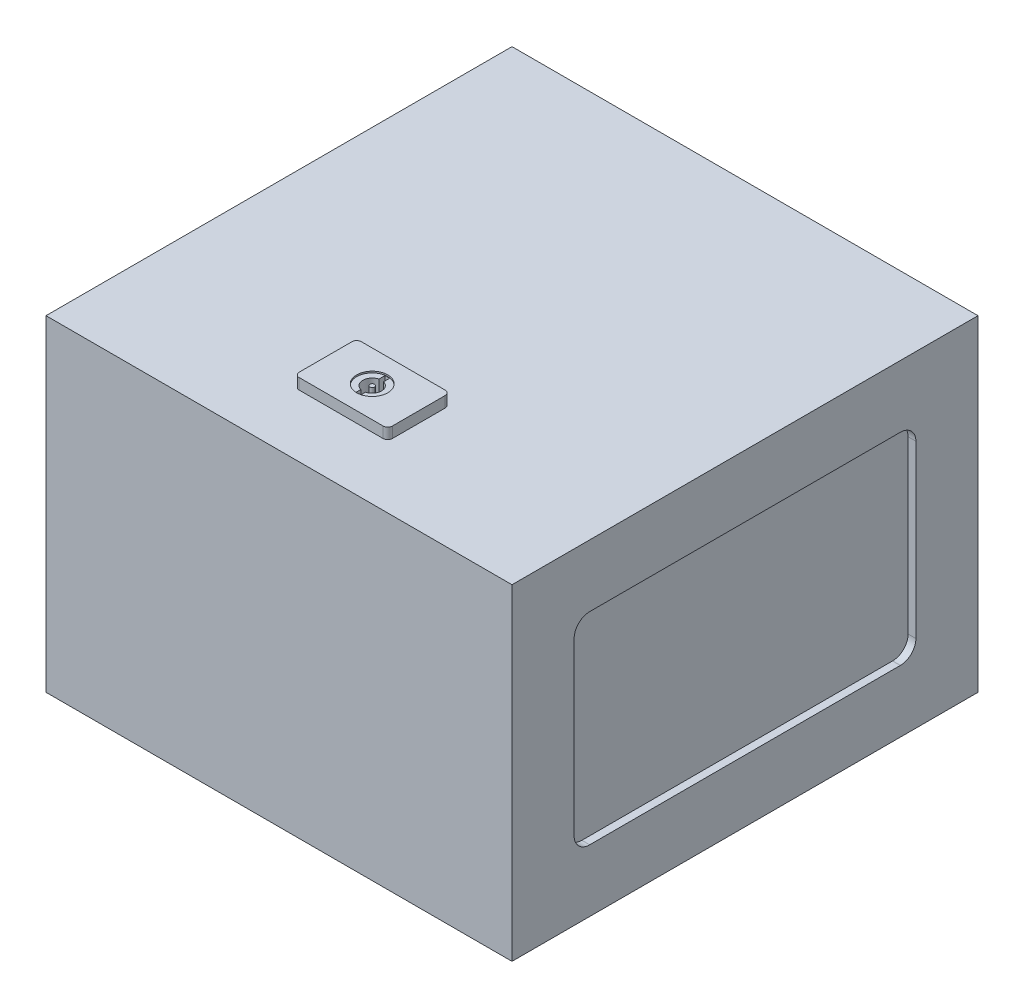
ISO-10303-21;
HEADER;
FILE_DESCRIPTION(('STEP AP214'),'2;1');
FILE_NAME('part.step','',(''),(''),'','','');
FILE_SCHEMA(('AUTOMOTIVE_DESIGN { 1 0 10303 214 1 1 1 1 }'));
ENDSEC;
DATA;
#1=APPLICATION_CONTEXT('core data for automotive mechanical design processes');
#2=APPLICATION_PROTOCOL_DEFINITION('international standard','automotive_design',2000,#1);
#3=PRODUCT_CONTEXT('',#1,'mechanical');
#4=PRODUCT('Part','Part','',(#3));
#5=PRODUCT_RELATED_PRODUCT_CATEGORY('part','',(#4));
#6=PRODUCT_DEFINITION_FORMATION('','',#4);
#7=PRODUCT_DEFINITION_CONTEXT('part definition',#1,'design');
#8=PRODUCT_DEFINITION('design','',#6,#7);
#9=PRODUCT_DEFINITION_SHAPE('','',#8);
#10=(LENGTH_UNIT() NAMED_UNIT(*) SI_UNIT(.MILLI.,.METRE.));
#11=(NAMED_UNIT(*) PLANE_ANGLE_UNIT() SI_UNIT($,.RADIAN.));
#12=(NAMED_UNIT(*) SI_UNIT($,.STERADIAN.) SOLID_ANGLE_UNIT());
#13=UNCERTAINTY_MEASURE_WITH_UNIT(LENGTH_MEASURE(1.E-05),#10,'distance_accuracy_value','');
#14=(GEOMETRIC_REPRESENTATION_CONTEXT(3) GLOBAL_UNCERTAINTY_ASSIGNED_CONTEXT((#13)) GLOBAL_UNIT_ASSIGNED_CONTEXT((#10,
#11,#12)) REPRESENTATION_CONTEXT('',''));
#15=CARTESIAN_POINT('',(0.,0.,0.));
#16=DIRECTION('',(0.,0.,1.));
#17=DIRECTION('',(1.,0.,0.));
#18=AXIS2_PLACEMENT_3D('',#15,#16,#17);
#19=CARTESIAN_POINT('',(0.,210.,0.));
#20=DIRECTION('',(0.,-1.,0.));
#21=DIRECTION('',(0.,0.,-1.));
#22=AXIS2_PLACEMENT_3D('',#19,#20,#21);
#23=PLANE('',#22);
#24=DIRECTION('',(0.,0.,-1.));
#25=VECTOR('',#24,1.);
#26=CARTESIAN_POINT('',(150.,210.,150.));
#27=LINE('',#26,#25);
#28=CARTESIAN_POINT('',(150.,210.,150.));
#29=VERTEX_POINT('',#28);
#30=CARTESIAN_POINT('',(150.,210.,-150.));
#31=VERTEX_POINT('',#30);
#32=EDGE_CURVE('E506',#29,#31,#27,.T.);
#33=ORIENTED_EDGE('',*,*,#32,.T.);
#34=DIRECTION('',(-1.,0.,0.));
#35=VECTOR('',#34,1.);
#36=CARTESIAN_POINT('',(-150.,210.,-150.));
#37=LINE('',#36,#35);
#38=CARTESIAN_POINT('',(-150.,210.,-150.));
#39=VERTEX_POINT('',#38);
#40=EDGE_CURVE('E510',#31,#39,#37,.T.);
#41=ORIENTED_EDGE('',*,*,#40,.T.);
#42=DIRECTION('',(0.,0.,1.));
#43=VECTOR('',#42,1.);
#44=CARTESIAN_POINT('',(-150.,210.,150.));
#45=LINE('',#44,#43);
#46=CARTESIAN_POINT('',(-150.,210.,150.));
#47=VERTEX_POINT('',#46);
#48=EDGE_CURVE('E514',#39,#47,#45,.T.);
#49=ORIENTED_EDGE('',*,*,#48,.T.);
#50=DIRECTION('',(1.,0.,0.));
#51=VECTOR('',#50,1.);
#52=CARTESIAN_POINT('',(-150.,210.,150.));
#53=LINE('',#52,#51);
#54=EDGE_CURVE('E517',#47,#29,#53,.T.);
#55=ORIENTED_EDGE('',*,*,#54,.T.);
#56=EDGE_LOOP('',(#33,#41,#49,#55));
#57=FACE_BOUND('',#56,.T.);
#58=CARTESIAN_POINT('',(27.,210.,107.));
#59=DIRECTION('',(0.,1.,0.));
#60=DIRECTION('',(0.,0.,1.));
#61=AXIS2_PLACEMENT_3D('',#58,#59,#60);
#62=CIRCLE('',#61,3.);
#63=CARTESIAN_POINT('',(26.9999999999999,210.,110.));
#64=VERTEX_POINT('',#63);
#65=CARTESIAN_POINT('',(30.,210.,107.));
#66=VERTEX_POINT('',#65);
#67=EDGE_CURVE('E328',#64,#66,#62,.T.);
#68=ORIENTED_EDGE('',*,*,#67,.F.);
#69=DIRECTION('',(1.,0.,0.));
#70=VECTOR('',#69,1.);
#71=CARTESIAN_POINT('',(-27.,210.,110.));
#72=LINE('',#71,#70);
#73=CARTESIAN_POINT('',(-27.,210.,110.));
#74=VERTEX_POINT('',#73);
#75=EDGE_CURVE('E337',#74,#64,#72,.T.);
#76=ORIENTED_EDGE('',*,*,#75,.F.);
#77=CARTESIAN_POINT('',(-27.,210.,107.));
#78=DIRECTION('',(0.,1.,0.));
#79=DIRECTION('',(0.,0.,-1.));
#80=AXIS2_PLACEMENT_3D('',#77,#78,#79);
#81=CIRCLE('',#80,3.);
#82=CARTESIAN_POINT('',(-30.,210.,107.));
#83=VERTEX_POINT('',#82);
#84=EDGE_CURVE('E380',#83,#74,#81,.T.);
#85=ORIENTED_EDGE('',*,*,#84,.F.);
#86=DIRECTION('',(0.,0.,1.));
#87=VECTOR('',#86,1.);
#88=CARTESIAN_POINT('',(-30.,210.,107.));
#89=LINE('',#88,#87);
#90=CARTESIAN_POINT('',(-30.,210.,73.));
#91=VERTEX_POINT('',#90);
#92=EDGE_CURVE('E376',#91,#83,#89,.T.);
#93=ORIENTED_EDGE('',*,*,#92,.F.);
#94=CARTESIAN_POINT('',(-27.,210.,73.));
#95=DIRECTION('',(0.,1.,0.));
#96=DIRECTION('',(0.,0.,-1.));
#97=AXIS2_PLACEMENT_3D('',#94,#95,#96);
#98=CIRCLE('',#97,3.);
#99=CARTESIAN_POINT('',(-27.,210.,70.));
#100=VERTEX_POINT('',#99);
#101=EDGE_CURVE('E372',#100,#91,#98,.T.);
#102=ORIENTED_EDGE('',*,*,#101,.F.);
#103=DIRECTION('',(-1.,0.,0.));
#104=VECTOR('',#103,1.);
#105=CARTESIAN_POINT('',(-27.,210.,70.));
#106=LINE('',#105,#104);
#107=CARTESIAN_POINT('',(26.9999999999999,210.,70.));
#108=VERTEX_POINT('',#107);
#109=EDGE_CURVE('E368',#108,#100,#106,.T.);
#110=ORIENTED_EDGE('',*,*,#109,.F.);
#111=CARTESIAN_POINT('',(27.,210.,73.));
#112=DIRECTION('',(0.,1.,0.));
#113=DIRECTION('',(0.,0.,-1.));
#114=AXIS2_PLACEMENT_3D('',#111,#112,#113);
#115=CIRCLE('',#114,3.);
#116=CARTESIAN_POINT('',(30.,210.,73.));
#117=VERTEX_POINT('',#116);
#118=EDGE_CURVE('E364',#117,#108,#115,.T.);
#119=ORIENTED_EDGE('',*,*,#118,.F.);
#120=DIRECTION('',(0.,0.,-1.));
#121=VECTOR('',#120,1.);
#122=CARTESIAN_POINT('',(30.,210.,107.));
#123=LINE('',#122,#121);
#124=EDGE_CURVE('E63',#66,#117,#123,.T.);
#125=ORIENTED_EDGE('',*,*,#124,.F.);
#126=EDGE_LOOP('',(#68,#76,#85,#93,#102,#110,#119,#125));
#127=FACE_BOUND('',#126,.T.);
#128=ADVANCED_FACE('F39',(#57,#127),#23,.F.);
#129=CARTESIAN_POINT('',(150.,210.,150.));
#130=DIRECTION('',(-1.,0.,0.));
#131=DIRECTION('',(0.,0.,1.));
#132=AXIS2_PLACEMENT_3D('',#129,#130,#131);
#133=PLANE('',#132);
#134=DIRECTION('',(0.,0.,-1.));
#135=VECTOR('',#134,1.);
#136=CARTESIAN_POINT('',(150.,40.,99.9999999999999));
#137=LINE('',#136,#135);
#138=CARTESIAN_POINT('',(150.,40.,99.9999999999999));
#139=VERTEX_POINT('',#138);
#140=CARTESIAN_POINT('',(150.,40.,-99.9999999999999));
#141=VERTEX_POINT('',#140);
#142=EDGE_CURVE('E454',#139,#141,#137,.T.);
#143=ORIENTED_EDGE('',*,*,#142,.F.);
#144=CARTESIAN_POINT('',(150.,50.,100.));
#145=DIRECTION('',(1.,0.,0.));
#146=DIRECTION('',(0.,0.,-1.));
#147=AXIS2_PLACEMENT_3D('',#144,#145,#146);
#148=CIRCLE('',#147,10.);
#149=CARTESIAN_POINT('',(150.,50.0000000000001,110.));
#150=VERTEX_POINT('',#149);
#151=EDGE_CURVE('E417',#150,#139,#148,.T.);
#152=ORIENTED_EDGE('',*,*,#151,.F.);
#153=DIRECTION('',(0.,-1.,0.));
#154=VECTOR('',#153,1.);
#155=CARTESIAN_POINT('',(150.,160.,110.));
#156=LINE('',#155,#154);
#157=CARTESIAN_POINT('',(150.,160.,110.));
#158=VERTEX_POINT('',#157);
#159=EDGE_CURVE('E423',#158,#150,#156,.T.);
#160=ORIENTED_EDGE('',*,*,#159,.F.);
#161=CARTESIAN_POINT('',(150.,160.,100.));
#162=DIRECTION('',(1.,0.,0.));
#163=DIRECTION('',(0.,0.,-1.));
#164=AXIS2_PLACEMENT_3D('',#161,#162,#163);
#165=CIRCLE('',#164,10.);
#166=CARTESIAN_POINT('',(150.,170.,99.9999999999999));
#167=VERTEX_POINT('',#166);
#168=EDGE_CURVE('E474',#167,#158,#165,.T.);
#169=ORIENTED_EDGE('',*,*,#168,.F.);
#170=DIRECTION('',(0.,0.,1.));
#171=VECTOR('',#170,1.);
#172=CARTESIAN_POINT('',(150.,170.,99.9999999999999));
#173=LINE('',#172,#171);
#174=CARTESIAN_POINT('',(150.,170.,-99.9999999999999));
#175=VERTEX_POINT('',#174);
#176=EDGE_CURVE('E470',#175,#167,#173,.T.);
#177=ORIENTED_EDGE('',*,*,#176,.F.);
#178=CARTESIAN_POINT('',(150.,160.,-100.));
#179=DIRECTION('',(1.,0.,0.));
#180=DIRECTION('',(0.,0.,1.));
#181=AXIS2_PLACEMENT_3D('',#178,#179,#180);
#182=CIRCLE('',#181,10.);
#183=CARTESIAN_POINT('',(150.,160.,-110.));
#184=VERTEX_POINT('',#183);
#185=EDGE_CURVE('E466',#184,#175,#182,.T.);
#186=ORIENTED_EDGE('',*,*,#185,.F.);
#187=DIRECTION('',(0.,1.,0.));
#188=VECTOR('',#187,1.);
#189=CARTESIAN_POINT('',(150.,160.,-110.));
#190=LINE('',#189,#188);
#191=CARTESIAN_POINT('',(150.,50.0000000000001,-110.));
#192=VERTEX_POINT('',#191);
#193=EDGE_CURVE('E462',#192,#184,#190,.T.);
#194=ORIENTED_EDGE('',*,*,#193,.F.);
#195=CARTESIAN_POINT('',(150.,50.,-100.));
#196=DIRECTION('',(1.,0.,0.));
#197=DIRECTION('',(0.,0.,-1.));
#198=AXIS2_PLACEMENT_3D('',#195,#196,#197);
#199=CIRCLE('',#198,9.99999999999999);
#200=EDGE_CURVE('E458',#141,#192,#199,.T.);
#201=ORIENTED_EDGE('',*,*,#200,.F.);
#202=EDGE_LOOP('',(#143,#152,#160,#169,#177,#186,#194,#201));
#203=FACE_BOUND('',#202,.T.);
#204=DIRECTION('',(0.,0.,-1.));
#205=VECTOR('',#204,1.);
#206=CARTESIAN_POINT('',(150.,0.,150.));
#207=LINE('',#206,#205);
#208=CARTESIAN_POINT('',(150.,0.,150.));
#209=VERTEX_POINT('',#208);
#210=CARTESIAN_POINT('',(150.,0.,-150.));
#211=VERTEX_POINT('',#210);
#212=EDGE_CURVE('E484',#209,#211,#207,.T.);
#213=ORIENTED_EDGE('',*,*,#212,.T.);
#214=DIRECTION('',(0.,-1.,0.));
#215=VECTOR('',#214,1.);
#216=CARTESIAN_POINT('',(150.,210.,-150.));
#217=LINE('',#216,#215);
#218=EDGE_CURVE('E11',#31,#211,#217,.T.);
#219=ORIENTED_EDGE('',*,*,#218,.F.);
#220=ORIENTED_EDGE('',*,*,#32,.F.);
#221=DIRECTION('',(0.,-1.,0.));
#222=VECTOR('',#221,1.);
#223=CARTESIAN_POINT('',(150.,210.,150.));
#224=LINE('',#223,#222);
#225=EDGE_CURVE('E520',#29,#209,#224,.T.);
#226=ORIENTED_EDGE('',*,*,#225,.T.);
#227=EDGE_LOOP('',(#213,#219,#220,#226));
#228=FACE_BOUND('',#227,.T.);
#229=ADVANCED_FACE('F41',(#203,#228),#133,.F.);
#230=CARTESIAN_POINT('',(-150.,210.,-150.));
#231=DIRECTION('',(0.,0.,1.));
#232=DIRECTION('',(1.,0.,0.));
#233=AXIS2_PLACEMENT_3D('',#230,#231,#232);
#234=PLANE('',#233);
#235=DIRECTION('',(-1.,0.,0.));
#236=VECTOR('',#235,1.);
#237=CARTESIAN_POINT('',(-150.,0.,-150.));
#238=LINE('',#237,#236);
#239=CARTESIAN_POINT('',(-150.,0.,-150.));
#240=VERTEX_POINT('',#239);
#241=EDGE_CURVE('E524',#211,#240,#238,.T.);
#242=ORIENTED_EDGE('',*,*,#241,.T.);
#243=DIRECTION('',(0.,-1.,0.));
#244=VECTOR('',#243,1.);
#245=CARTESIAN_POINT('',(-150.,210.,-150.));
#246=LINE('',#245,#244);
#247=EDGE_CURVE('E48',#39,#240,#246,.T.);
#248=ORIENTED_EDGE('',*,*,#247,.F.);
#249=ORIENTED_EDGE('',*,*,#40,.F.);
#250=ORIENTED_EDGE('',*,*,#218,.T.);
#251=EDGE_LOOP('',(#242,#248,#249,#250));
#252=FACE_BOUND('',#251,.T.);
#253=ADVANCED_FACE('F559',(#252),#234,.F.);
#254=CARTESIAN_POINT('',(-150.,210.,150.));
#255=DIRECTION('',(1.,0.,0.));
#256=DIRECTION('',(0.,0.,-1.));
#257=AXIS2_PLACEMENT_3D('',#254,#255,#256);
#258=PLANE('',#257);
#259=DIRECTION('',(0.,0.,1.));
#260=VECTOR('',#259,1.);
#261=CARTESIAN_POINT('',(-150.,0.,150.));
#262=LINE('',#261,#260);
#263=CARTESIAN_POINT('',(-150.,0.,150.));
#264=VERTEX_POINT('',#263);
#265=EDGE_CURVE('E527',#240,#264,#262,.T.);
#266=ORIENTED_EDGE('',*,*,#265,.T.);
#267=DIRECTION('',(0.,-1.,0.));
#268=VECTOR('',#267,1.);
#269=CARTESIAN_POINT('',(-150.,210.,150.));
#270=LINE('',#269,#268);
#271=EDGE_CURVE('E535',#47,#264,#270,.T.);
#272=ORIENTED_EDGE('',*,*,#271,.F.);
#273=ORIENTED_EDGE('',*,*,#48,.F.);
#274=ORIENTED_EDGE('',*,*,#247,.T.);
#275=EDGE_LOOP('',(#266,#272,#273,#274));
#276=FACE_BOUND('',#275,.T.);
#277=ADVANCED_FACE('F544',(#276),#258,.F.);
#278=CARTESIAN_POINT('',(-150.,210.,150.));
#279=DIRECTION('',(0.,0.,-1.));
#280=DIRECTION('',(-1.,0.,0.));
#281=AXIS2_PLACEMENT_3D('',#278,#279,#280);
#282=PLANE('',#281);
#283=DIRECTION('',(1.,0.,0.));
#284=VECTOR('',#283,1.);
#285=CARTESIAN_POINT('',(-150.,0.,150.));
#286=LINE('',#285,#284);
#287=EDGE_CURVE('E511',#264,#209,#286,.T.);
#288=ORIENTED_EDGE('',*,*,#287,.T.);
#289=ORIENTED_EDGE('',*,*,#225,.F.);
#290=ORIENTED_EDGE('',*,*,#54,.F.);
#291=ORIENTED_EDGE('',*,*,#271,.T.);
#292=EDGE_LOOP('',(#288,#289,#290,#291));
#293=FACE_BOUND('',#292,.T.);
#294=ADVANCED_FACE('F553',(#293),#282,.F.);
#295=CARTESIAN_POINT('',(0.,0.,0.));
#296=DIRECTION('',(0.,-1.,0.));
#297=DIRECTION('',(0.,0.,-1.));
#298=AXIS2_PLACEMENT_3D('',#295,#296,#297);
#299=PLANE('',#298);
#300=ORIENTED_EDGE('',*,*,#212,.F.);
#301=ORIENTED_EDGE('',*,*,#287,.F.);
#302=ORIENTED_EDGE('',*,*,#265,.F.);
#303=ORIENTED_EDGE('',*,*,#241,.F.);
#304=EDGE_LOOP('',(#300,#301,#302,#303));
#305=FACE_BOUND('',#304,.T.);
#306=ADVANCED_FACE('F550',(#305),#299,.T.);
#307=CARTESIAN_POINT('',(145.,50.,100.));
#308=DIRECTION('',(1.,0.,0.));
#309=DIRECTION('',(0.,0.,-1.));
#310=AXIS2_PLACEMENT_3D('',#307,#308,#309);
#311=CYLINDRICAL_SURFACE('',#310,10.);
#312=ORIENTED_EDGE('',*,*,#151,.T.);
#313=DIRECTION('',(1.,0.,0.));
#314=VECTOR('',#313,1.);
#315=CARTESIAN_POINT('',(145.,40.,99.9999999999999));
#316=LINE('',#315,#314);
#317=CARTESIAN_POINT('',(145.,40.,99.9999999999999));
#318=VERTEX_POINT('',#317);
#319=EDGE_CURVE('E451',#318,#139,#316,.T.);
#320=ORIENTED_EDGE('',*,*,#319,.F.);
#321=CARTESIAN_POINT('',(145.,50.,100.));
#322=DIRECTION('',(1.,0.,0.));
#323=DIRECTION('',(0.,0.,-1.));
#324=AXIS2_PLACEMENT_3D('',#321,#322,#323);
#325=CIRCLE('',#324,10.);
#326=CARTESIAN_POINT('',(145.,50.0000000000001,110.));
#327=VERTEX_POINT('',#326);
#328=EDGE_CURVE('E418',#327,#318,#325,.T.);
#329=ORIENTED_EDGE('',*,*,#328,.F.);
#330=DIRECTION('',(1.,0.,0.));
#331=VECTOR('',#330,1.);
#332=CARTESIAN_POINT('',(145.,50.0000000000001,110.));
#333=LINE('',#332,#331);
#334=EDGE_CURVE('E481',#327,#150,#333,.T.);
#335=ORIENTED_EDGE('',*,*,#334,.T.);
#336=EDGE_LOOP('',(#312,#320,#329,#335));
#337=FACE_BOUND('',#336,.T.);
#338=ADVANCED_FACE('F573',(#337),#311,.F.);
#339=CARTESIAN_POINT('',(145.,160.,110.));
#340=DIRECTION('',(0.,0.,1.));
#341=DIRECTION('',(0.,-1.,0.));
#342=AXIS2_PLACEMENT_3D('',#339,#340,#341);
#343=PLANE('',#342);
#344=ORIENTED_EDGE('',*,*,#159,.T.);
#345=ORIENTED_EDGE('',*,*,#334,.F.);
#346=DIRECTION('',(0.,-1.,0.));
#347=VECTOR('',#346,1.);
#348=CARTESIAN_POINT('',(145.,160.,110.));
#349=LINE('',#348,#347);
#350=CARTESIAN_POINT('',(145.,160.,110.));
#351=VERTEX_POINT('',#350);
#352=EDGE_CURVE('E447',#351,#327,#349,.T.);
#353=ORIENTED_EDGE('',*,*,#352,.F.);
#354=DIRECTION('',(1.,0.,0.));
#355=VECTOR('',#354,1.);
#356=CARTESIAN_POINT('',(145.,160.,110.));
#357=LINE('',#356,#355);
#358=EDGE_CURVE('E485',#351,#158,#357,.T.);
#359=ORIENTED_EDGE('',*,*,#358,.T.);
#360=EDGE_LOOP('',(#344,#345,#353,#359));
#361=FACE_BOUND('',#360,.T.);
#362=ADVANCED_FACE('F593',(#361),#343,.F.);
#363=CARTESIAN_POINT('',(145.,160.,100.));
#364=DIRECTION('',(1.,0.,0.));
#365=DIRECTION('',(0.,0.,-1.));
#366=AXIS2_PLACEMENT_3D('',#363,#364,#365);
#367=CYLINDRICAL_SURFACE('',#366,10.);
#368=ORIENTED_EDGE('',*,*,#168,.T.);
#369=ORIENTED_EDGE('',*,*,#358,.F.);
#370=CARTESIAN_POINT('',(145.,160.,100.));
#371=DIRECTION('',(1.,0.,0.));
#372=DIRECTION('',(0.,0.,-1.));
#373=AXIS2_PLACEMENT_3D('',#370,#371,#372);
#374=CIRCLE('',#373,10.);
#375=CARTESIAN_POINT('',(145.,170.,99.9999999999999));
#376=VERTEX_POINT('',#375);
#377=EDGE_CURVE('E443',#376,#351,#374,.T.);
#378=ORIENTED_EDGE('',*,*,#377,.F.);
#379=DIRECTION('',(1.,0.,0.));
#380=VECTOR('',#379,1.);
#381=CARTESIAN_POINT('',(145.,170.,99.9999999999999));
#382=LINE('',#381,#380);
#383=EDGE_CURVE('E488',#376,#167,#382,.T.);
#384=ORIENTED_EDGE('',*,*,#383,.T.);
#385=EDGE_LOOP('',(#368,#369,#378,#384));
#386=FACE_BOUND('',#385,.T.);
#387=ADVANCED_FACE('F600',(#386),#367,.F.);
#388=CARTESIAN_POINT('',(145.,170.,99.9999999999999));
#389=DIRECTION('',(0.,1.,0.));
#390=DIRECTION('',(0.,0.,1.));
#391=AXIS2_PLACEMENT_3D('',#388,#389,#390);
#392=PLANE('',#391);
#393=ORIENTED_EDGE('',*,*,#176,.T.);
#394=ORIENTED_EDGE('',*,*,#383,.F.);
#395=DIRECTION('',(0.,0.,1.));
#396=VECTOR('',#395,1.);
#397=CARTESIAN_POINT('',(145.,170.,99.9999999999999));
#398=LINE('',#397,#396);
#399=CARTESIAN_POINT('',(145.,170.,-99.9999999999999));
#400=VERTEX_POINT('',#399);
#401=EDGE_CURVE('E439',#400,#376,#398,.T.);
#402=ORIENTED_EDGE('',*,*,#401,.F.);
#403=DIRECTION('',(1.,0.,0.));
#404=VECTOR('',#403,1.);
#405=CARTESIAN_POINT('',(145.,170.,-99.9999999999999));
#406=LINE('',#405,#404);
#407=EDGE_CURVE('E491',#400,#175,#406,.T.);
#408=ORIENTED_EDGE('',*,*,#407,.T.);
#409=EDGE_LOOP('',(#393,#394,#402,#408));
#410=FACE_BOUND('',#409,.T.);
#411=ADVANCED_FACE('F608',(#410),#392,.F.);
#412=CARTESIAN_POINT('',(145.,160.,-100.));
#413=DIRECTION('',(1.,0.,0.));
#414=DIRECTION('',(0.,0.,-1.));
#415=AXIS2_PLACEMENT_3D('',#412,#413,#414);
#416=CYLINDRICAL_SURFACE('',#415,10.);
#417=ORIENTED_EDGE('',*,*,#185,.T.);
#418=ORIENTED_EDGE('',*,*,#407,.F.);
#419=CARTESIAN_POINT('',(145.,160.,-100.));
#420=DIRECTION('',(1.,0.,0.));
#421=DIRECTION('',(0.,0.,1.));
#422=AXIS2_PLACEMENT_3D('',#419,#420,#421);
#423=CIRCLE('',#422,10.);
#424=CARTESIAN_POINT('',(145.,160.,-110.));
#425=VERTEX_POINT('',#424);
#426=EDGE_CURVE('E435',#425,#400,#423,.T.);
#427=ORIENTED_EDGE('',*,*,#426,.F.);
#428=DIRECTION('',(1.,0.,0.));
#429=VECTOR('',#428,1.);
#430=CARTESIAN_POINT('',(145.,160.,-110.));
#431=LINE('',#430,#429);
#432=EDGE_CURVE('E494',#425,#184,#431,.T.);
#433=ORIENTED_EDGE('',*,*,#432,.T.);
#434=EDGE_LOOP('',(#417,#418,#427,#433));
#435=FACE_BOUND('',#434,.T.);
#436=ADVANCED_FACE('F616',(#435),#416,.F.);
#437=CARTESIAN_POINT('',(145.,160.,-110.));
#438=DIRECTION('',(0.,0.,-1.));
#439=DIRECTION('',(0.,1.,0.));
#440=AXIS2_PLACEMENT_3D('',#437,#438,#439);
#441=PLANE('',#440);
#442=ORIENTED_EDGE('',*,*,#193,.T.);
#443=ORIENTED_EDGE('',*,*,#432,.F.);
#444=DIRECTION('',(0.,1.,0.));
#445=VECTOR('',#444,1.);
#446=CARTESIAN_POINT('',(145.,160.,-110.));
#447=LINE('',#446,#445);
#448=CARTESIAN_POINT('',(145.,50.0000000000001,-110.));
#449=VERTEX_POINT('',#448);
#450=EDGE_CURVE('E431',#449,#425,#447,.T.);
#451=ORIENTED_EDGE('',*,*,#450,.F.);
#452=DIRECTION('',(1.,0.,0.));
#453=VECTOR('',#452,1.);
#454=CARTESIAN_POINT('',(145.,50.0000000000001,-110.));
#455=LINE('',#454,#453);
#456=EDGE_CURVE('E497',#449,#192,#455,.T.);
#457=ORIENTED_EDGE('',*,*,#456,.T.);
#458=EDGE_LOOP('',(#442,#443,#451,#457));
#459=FACE_BOUND('',#458,.T.);
#460=ADVANCED_FACE('F624',(#459),#441,.F.);
#461=CARTESIAN_POINT('',(145.,50.,-100.));
#462=DIRECTION('',(1.,0.,0.));
#463=DIRECTION('',(0.,0.,-1.));
#464=AXIS2_PLACEMENT_3D('',#461,#462,#463);
#465=CYLINDRICAL_SURFACE('',#464,9.99999999999999);
#466=ORIENTED_EDGE('',*,*,#200,.T.);
#467=ORIENTED_EDGE('',*,*,#456,.F.);
#468=CARTESIAN_POINT('',(145.,50.,-100.));
#469=DIRECTION('',(1.,0.,0.));
#470=DIRECTION('',(0.,0.,-1.));
#471=AXIS2_PLACEMENT_3D('',#468,#469,#470);
#472=CIRCLE('',#471,9.99999999999999);
#473=CARTESIAN_POINT('',(145.,40.,-99.9999999999999));
#474=VERTEX_POINT('',#473);
#475=EDGE_CURVE('E427',#474,#449,#472,.T.);
#476=ORIENTED_EDGE('',*,*,#475,.F.);
#477=DIRECTION('',(1.,0.,0.));
#478=VECTOR('',#477,1.);
#479=CARTESIAN_POINT('',(145.,40.,-99.9999999999999));
#480=LINE('',#479,#478);
#481=EDGE_CURVE('E500',#474,#141,#480,.T.);
#482=ORIENTED_EDGE('',*,*,#481,.T.);
#483=EDGE_LOOP('',(#466,#467,#476,#482));
#484=FACE_BOUND('',#483,.T.);
#485=ADVANCED_FACE('F632',(#484),#465,.F.);
#486=CARTESIAN_POINT('',(145.,40.,99.9999999999999));
#487=DIRECTION('',(0.,-1.,0.));
#488=DIRECTION('',(0.,0.,-1.));
#489=AXIS2_PLACEMENT_3D('',#486,#487,#488);
#490=PLANE('',#489);
#491=ORIENTED_EDGE('',*,*,#142,.T.);
#492=ORIENTED_EDGE('',*,*,#481,.F.);
#493=DIRECTION('',(0.,0.,-1.));
#494=VECTOR('',#493,1.);
#495=CARTESIAN_POINT('',(145.,40.,99.9999999999999));
#496=LINE('',#495,#494);
#497=EDGE_CURVE('E422',#318,#474,#496,.T.);
#498=ORIENTED_EDGE('',*,*,#497,.F.);
#499=ORIENTED_EDGE('',*,*,#319,.T.);
#500=EDGE_LOOP('',(#491,#492,#498,#499));
#501=FACE_BOUND('',#500,.T.);
#502=ADVANCED_FACE('F640',(#501),#490,.F.);
#503=CARTESIAN_POINT('',(145.,50.,100.));
#504=DIRECTION('',(1.,0.,0.));
#505=DIRECTION('',(0.,0.,-1.));
#506=AXIS2_PLACEMENT_3D('',#503,#504,#505);
#507=PLANE('',#506);
#508=ORIENTED_EDGE('',*,*,#328,.T.);
#509=ORIENTED_EDGE('',*,*,#497,.T.);
#510=ORIENTED_EDGE('',*,*,#475,.T.);
#511=ORIENTED_EDGE('',*,*,#450,.T.);
#512=ORIENTED_EDGE('',*,*,#426,.T.);
#513=ORIENTED_EDGE('',*,*,#401,.T.);
#514=ORIENTED_EDGE('',*,*,#377,.T.);
#515=ORIENTED_EDGE('',*,*,#352,.T.);
#516=EDGE_LOOP('',(#508,#509,#510,#511,#512,#513,#514,#515));
#517=FACE_BOUND('',#516,.T.);
#518=ADVANCED_FACE('F648',(#517),#507,.T.);
#519=CARTESIAN_POINT('',(27.,217.,107.));
#520=DIRECTION('',(0.,-1.,0.));
#521=DIRECTION('',(0.,0.,-1.));
#522=AXIS2_PLACEMENT_3D('',#519,#520,#521);
#523=CYLINDRICAL_SURFACE('',#522,3.);
#524=ORIENTED_EDGE('',*,*,#67,.T.);
#525=DIRECTION('',(0.,-1.,0.));
#526=VECTOR('',#525,1.);
#527=CARTESIAN_POINT('',(30.,217.,107.));
#528=LINE('',#527,#526);
#529=CARTESIAN_POINT('',(30.,217.,107.));
#530=VERTEX_POINT('',#529);
#531=EDGE_CURVE('E414',#530,#66,#528,.T.);
#532=ORIENTED_EDGE('',*,*,#531,.F.);
#533=CARTESIAN_POINT('',(27.,217.,107.));
#534=DIRECTION('',(0.,1.,0.));
#535=DIRECTION('',(0.,0.,1.));
#536=AXIS2_PLACEMENT_3D('',#533,#534,#535);
#537=CIRCLE('',#536,3.);
#538=CARTESIAN_POINT('',(26.9999999999999,217.,110.));
#539=VERTEX_POINT('',#538);
#540=EDGE_CURVE('E332',#539,#530,#537,.T.);
#541=ORIENTED_EDGE('',*,*,#540,.F.);
#542=DIRECTION('',(0.,-1.,0.));
#543=VECTOR('',#542,1.);
#544=CARTESIAN_POINT('',(26.9999999999999,217.,110.));
#545=LINE('',#544,#543);
#546=EDGE_CURVE('E358',#539,#64,#545,.T.);
#547=ORIENTED_EDGE('',*,*,#546,.T.);
#548=EDGE_LOOP('',(#524,#532,#541,#547));
#549=FACE_BOUND('',#548,.T.);
#550=ADVANCED_FACE('F655',(#549),#523,.T.);
#551=CARTESIAN_POINT('',(30.,217.,107.));
#552=DIRECTION('',(-1.,0.,0.));
#553=DIRECTION('',(0.,0.,1.));
#554=AXIS2_PLACEMENT_3D('',#551,#552,#553);
#555=PLANE('',#554);
#556=ORIENTED_EDGE('',*,*,#124,.T.);
#557=DIRECTION('',(0.,-1.,0.));
#558=VECTOR('',#557,1.);
#559=CARTESIAN_POINT('',(30.,217.,73.));
#560=LINE('',#559,#558);
#561=CARTESIAN_POINT('',(30.,217.,73.));
#562=VERTEX_POINT('',#561);
#563=EDGE_CURVE('E410',#562,#117,#560,.T.);
#564=ORIENTED_EDGE('',*,*,#563,.F.);
#565=DIRECTION('',(0.,0.,-1.));
#566=VECTOR('',#565,1.);
#567=CARTESIAN_POINT('',(30.,217.,107.));
#568=LINE('',#567,#566);
#569=EDGE_CURVE('E336',#530,#562,#568,.T.);
#570=ORIENTED_EDGE('',*,*,#569,.F.);
#571=ORIENTED_EDGE('',*,*,#531,.T.);
#572=EDGE_LOOP('',(#556,#564,#570,#571));
#573=FACE_BOUND('',#572,.T.);
#574=ADVANCED_FACE('F663',(#573),#555,.F.);
#575=CARTESIAN_POINT('',(27.,217.,73.));
#576=DIRECTION('',(0.,-1.,0.));
#577=DIRECTION('',(0.,0.,-1.));
#578=AXIS2_PLACEMENT_3D('',#575,#576,#577);
#579=CYLINDRICAL_SURFACE('',#578,3.);
#580=ORIENTED_EDGE('',*,*,#118,.T.);
#581=DIRECTION('',(0.,-1.,0.));
#582=VECTOR('',#581,1.);
#583=CARTESIAN_POINT('',(26.9999999999999,217.,70.));
#584=LINE('',#583,#582);
#585=CARTESIAN_POINT('',(26.9999999999999,217.,70.));
#586=VERTEX_POINT('',#585);
#587=EDGE_CURVE('E406',#586,#108,#584,.T.);
#588=ORIENTED_EDGE('',*,*,#587,.F.);
#589=CARTESIAN_POINT('',(27.,217.,73.));
#590=DIRECTION('',(0.,1.,0.));
#591=DIRECTION('',(0.,0.,-1.));
#592=AXIS2_PLACEMENT_3D('',#589,#590,#591);
#593=CIRCLE('',#592,3.);
#594=EDGE_CURVE('E340',#562,#586,#593,.T.);
#595=ORIENTED_EDGE('',*,*,#594,.F.);
#596=ORIENTED_EDGE('',*,*,#563,.T.);
#597=EDGE_LOOP('',(#580,#588,#595,#596));
#598=FACE_BOUND('',#597,.T.);
#599=ADVANCED_FACE('F671',(#598),#579,.T.);
#600=CARTESIAN_POINT('',(-27.,217.,70.));
#601=DIRECTION('',(0.,0.,1.));
#602=DIRECTION('',(1.,0.,0.));
#603=AXIS2_PLACEMENT_3D('',#600,#601,#602);
#604=PLANE('',#603);
#605=ORIENTED_EDGE('',*,*,#109,.T.);
#606=DIRECTION('',(0.,-1.,0.));
#607=VECTOR('',#606,1.);
#608=CARTESIAN_POINT('',(-27.,217.,70.));
#609=LINE('',#608,#607);
#610=CARTESIAN_POINT('',(-27.,217.,70.));
#611=VERTEX_POINT('',#610);
#612=EDGE_CURVE('E402',#611,#100,#609,.T.);
#613=ORIENTED_EDGE('',*,*,#612,.F.);
#614=DIRECTION('',(-1.,0.,0.));
#615=VECTOR('',#614,1.);
#616=CARTESIAN_POINT('',(-27.,217.,70.));
#617=LINE('',#616,#615);
#618=EDGE_CURVE('E343',#586,#611,#617,.T.);
#619=ORIENTED_EDGE('',*,*,#618,.F.);
#620=ORIENTED_EDGE('',*,*,#587,.T.);
#621=EDGE_LOOP('',(#605,#613,#619,#620));
#622=FACE_BOUND('',#621,.T.);
#623=ADVANCED_FACE('F679',(#622),#604,.F.);
#624=CARTESIAN_POINT('',(-27.,217.,73.));
#625=DIRECTION('',(0.,-1.,0.));
#626=DIRECTION('',(0.,0.,-1.));
#627=AXIS2_PLACEMENT_3D('',#624,#625,#626);
#628=CYLINDRICAL_SURFACE('',#627,3.);
#629=ORIENTED_EDGE('',*,*,#101,.T.);
#630=DIRECTION('',(0.,-1.,0.));
#631=VECTOR('',#630,1.);
#632=CARTESIAN_POINT('',(-30.,217.,73.));
#633=LINE('',#632,#631);
#634=CARTESIAN_POINT('',(-30.,217.,73.));
#635=VERTEX_POINT('',#634);
#636=EDGE_CURVE('E398',#635,#91,#633,.T.);
#637=ORIENTED_EDGE('',*,*,#636,.F.);
#638=CARTESIAN_POINT('',(-27.,217.,73.));
#639=DIRECTION('',(0.,1.,0.));
#640=DIRECTION('',(0.,0.,-1.));
#641=AXIS2_PLACEMENT_3D('',#638,#639,#640);
#642=CIRCLE('',#641,3.);
#643=EDGE_CURVE('E346',#611,#635,#642,.T.);
#644=ORIENTED_EDGE('',*,*,#643,.F.);
#645=ORIENTED_EDGE('',*,*,#612,.T.);
#646=EDGE_LOOP('',(#629,#637,#644,#645));
#647=FACE_BOUND('',#646,.T.);
#648=ADVANCED_FACE('F687',(#647),#628,.T.);
#649=CARTESIAN_POINT('',(-30.,217.,107.));
#650=DIRECTION('',(1.,0.,0.));
#651=DIRECTION('',(0.,0.,-1.));
#652=AXIS2_PLACEMENT_3D('',#649,#650,#651);
#653=PLANE('',#652);
#654=ORIENTED_EDGE('',*,*,#92,.T.);
#655=DIRECTION('',(0.,-1.,0.));
#656=VECTOR('',#655,1.);
#657=CARTESIAN_POINT('',(-30.,217.,107.));
#658=LINE('',#657,#656);
#659=CARTESIAN_POINT('',(-30.,217.,107.));
#660=VERTEX_POINT('',#659);
#661=EDGE_CURVE('E394',#660,#83,#658,.T.);
#662=ORIENTED_EDGE('',*,*,#661,.F.);
#663=DIRECTION('',(0.,0.,1.));
#664=VECTOR('',#663,1.);
#665=CARTESIAN_POINT('',(-30.,217.,107.));
#666=LINE('',#665,#664);
#667=EDGE_CURVE('E349',#635,#660,#666,.T.);
#668=ORIENTED_EDGE('',*,*,#667,.F.);
#669=ORIENTED_EDGE('',*,*,#636,.T.);
#670=EDGE_LOOP('',(#654,#662,#668,#669));
#671=FACE_BOUND('',#670,.T.);
#672=ADVANCED_FACE('F695',(#671),#653,.F.);
#673=CARTESIAN_POINT('',(-27.,217.,107.));
#674=DIRECTION('',(0.,-1.,0.));
#675=DIRECTION('',(0.,0.,-1.));
#676=AXIS2_PLACEMENT_3D('',#673,#674,#675);
#677=CYLINDRICAL_SURFACE('',#676,3.);
#678=ORIENTED_EDGE('',*,*,#84,.T.);
#679=DIRECTION('',(0.,-1.,0.));
#680=VECTOR('',#679,1.);
#681=CARTESIAN_POINT('',(-27.,217.,110.));
#682=LINE('',#681,#680);
#683=CARTESIAN_POINT('',(-27.,217.,110.));
#684=VERTEX_POINT('',#683);
#685=EDGE_CURVE('E390',#684,#74,#682,.T.);
#686=ORIENTED_EDGE('',*,*,#685,.F.);
#687=CARTESIAN_POINT('',(-27.,217.,107.));
#688=DIRECTION('',(0.,1.,0.));
#689=DIRECTION('',(0.,0.,-1.));
#690=AXIS2_PLACEMENT_3D('',#687,#688,#689);
#691=CIRCLE('',#690,3.);
#692=EDGE_CURVE('E352',#660,#684,#691,.T.);
#693=ORIENTED_EDGE('',*,*,#692,.F.);
#694=ORIENTED_EDGE('',*,*,#661,.T.);
#695=EDGE_LOOP('',(#678,#686,#693,#694));
#696=FACE_BOUND('',#695,.T.);
#697=ADVANCED_FACE('F703',(#696),#677,.T.);
#698=CARTESIAN_POINT('',(-27.,217.,110.));
#699=DIRECTION('',(0.,0.,-1.));
#700=DIRECTION('',(-1.,0.,0.));
#701=AXIS2_PLACEMENT_3D('',#698,#699,#700);
#702=PLANE('',#701);
#703=ORIENTED_EDGE('',*,*,#75,.T.);
#704=ORIENTED_EDGE('',*,*,#546,.F.);
#705=DIRECTION('',(1.,0.,0.));
#706=VECTOR('',#705,1.);
#707=CARTESIAN_POINT('',(-27.,217.,110.));
#708=LINE('',#707,#706);
#709=EDGE_CURVE('E355',#684,#539,#708,.T.);
#710=ORIENTED_EDGE('',*,*,#709,.F.);
#711=ORIENTED_EDGE('',*,*,#685,.T.);
#712=EDGE_LOOP('',(#703,#704,#710,#711));
#713=FACE_BOUND('',#712,.T.);
#714=ADVANCED_FACE('F711',(#713),#702,.F.);
#715=CARTESIAN_POINT('',(27.,217.,107.));
#716=DIRECTION('',(0.,1.,0.));
#717=DIRECTION('',(0.,0.,1.));
#718=AXIS2_PLACEMENT_3D('',#715,#716,#717);
#719=PLANE('',#718);
#720=CARTESIAN_POINT('',(0.,217.,90.));
#721=DIRECTION('',(0.,1.,0.));
#722=DIRECTION('',(0.,0.,1.));
#723=AXIS2_PLACEMENT_3D('',#720,#721,#722);
#724=CIRCLE('',#723,10.);
#725=CARTESIAN_POINT('',(0.,217.,100.));
#726=VERTEX_POINT('',#725);
#727=EDGE_CURVE('E306',#726,#726,#724,.T.);
#728=ORIENTED_EDGE('',*,*,#727,.F.);
#729=EDGE_LOOP('',(#728));
#730=FACE_BOUND('',#729,.T.);
#731=ORIENTED_EDGE('',*,*,#540,.T.);
#732=ORIENTED_EDGE('',*,*,#569,.T.);
#733=ORIENTED_EDGE('',*,*,#594,.T.);
#734=ORIENTED_EDGE('',*,*,#618,.T.);
#735=ORIENTED_EDGE('',*,*,#643,.T.);
#736=ORIENTED_EDGE('',*,*,#667,.T.);
#737=ORIENTED_EDGE('',*,*,#692,.T.);
#738=ORIENTED_EDGE('',*,*,#709,.T.);
#739=EDGE_LOOP('',(#731,#732,#733,#734,#735,#736,#737,#738));
#740=FACE_BOUND('',#739,.T.);
#741=ADVANCED_FACE('F719',(#730,#740),#719,.T.);
#742=CARTESIAN_POINT('',(0.,216.,90.));
#743=DIRECTION('',(0.,1.,0.));
#744=DIRECTION('',(0.,0.,1.));
#745=AXIS2_PLACEMENT_3D('',#742,#743,#744);
#746=CYLINDRICAL_SURFACE('',#745,10.);
#747=CARTESIAN_POINT('',(0.,216.,90.));
#748=DIRECTION('',(0.,1.,0.));
#749=DIRECTION('',(0.,0.,1.));
#750=AXIS2_PLACEMENT_3D('',#747,#748,#749);
#751=CIRCLE('',#750,10.);
#752=CARTESIAN_POINT('',(0.,216.,100.));
#753=VERTEX_POINT('',#752);
#754=EDGE_CURVE('E324',#753,#753,#751,.T.);
#755=ORIENTED_EDGE('',*,*,#754,.F.);
#756=EDGE_LOOP('',(#755));
#757=FACE_BOUND('',#756,.T.);
#758=ORIENTED_EDGE('',*,*,#727,.T.);
#759=EDGE_LOOP('',(#758));
#760=FACE_BOUND('',#759,.T.);
#761=ADVANCED_FACE('F727',(#757,#760),#746,.F.);
#762=CARTESIAN_POINT('',(0.,216.,90.));
#763=DIRECTION('',(0.,1.,0.));
#764=DIRECTION('',(0.,0.,1.));
#765=AXIS2_PLACEMENT_3D('',#762,#763,#764);
#766=PLANE('',#765);
#767=CARTESIAN_POINT('',(0.,216.,90.));
#768=DIRECTION('',(0.,1.,0.));
#769=DIRECTION('',(0.,0.,1.));
#770=AXIS2_PLACEMENT_3D('',#767,#768,#769);
#771=CIRCLE('',#770,6.00000000000001);
#772=CARTESIAN_POINT('',(-1.5,216.,84.1905249806888));
#773=VERTEX_POINT('',#772);
#774=CARTESIAN_POINT('',(-1.5,216.,95.8094750193111));
#775=VERTEX_POINT('',#774);
#776=EDGE_CURVE('E55',#773,#775,#771,.T.);
#777=ORIENTED_EDGE('',*,*,#776,.F.);
#778=DIRECTION('',(0.,0.,1.));
#779=VECTOR('',#778,1.);
#780=CARTESIAN_POINT('',(-1.5,216.,84.1905249806888));
#781=LINE('',#780,#779);
#782=CARTESIAN_POINT('',(-1.5,216.,80.25));
#783=VERTEX_POINT('',#782);
#784=EDGE_CURVE('E249',#783,#773,#781,.T.);
#785=ORIENTED_EDGE('',*,*,#784,.F.);
#786=DIRECTION('',(-1.,0.,0.));
#787=VECTOR('',#786,1.);
#788=CARTESIAN_POINT('',(-1.5,216.,80.25));
#789=LINE('',#788,#787);
#790=CARTESIAN_POINT('',(1.5,216.,80.25));
#791=VERTEX_POINT('',#790);
#792=EDGE_CURVE('E253',#791,#783,#789,.T.);
#793=ORIENTED_EDGE('',*,*,#792,.F.);
#794=DIRECTION('',(0.,0.,-1.));
#795=VECTOR('',#794,1.);
#796=CARTESIAN_POINT('',(1.5,216.,84.1905249806888));
#797=LINE('',#796,#795);
#798=CARTESIAN_POINT('',(1.5,216.,84.1905249806888));
#799=VERTEX_POINT('',#798);
#800=EDGE_CURVE('E296',#799,#791,#797,.T.);
#801=ORIENTED_EDGE('',*,*,#800,.F.);
#802=CARTESIAN_POINT('',(0.,216.,90.));
#803=DIRECTION('',(0.,1.,0.));
#804=DIRECTION('',(0.,0.,1.));
#805=AXIS2_PLACEMENT_3D('',#802,#803,#804);
#806=CIRCLE('',#805,6.00000000000001);
#807=CARTESIAN_POINT('',(1.5,216.,95.8094750193111));
#808=VERTEX_POINT('',#807);
#809=EDGE_CURVE('E292',#808,#799,#806,.T.);
#810=ORIENTED_EDGE('',*,*,#809,.F.);
#811=DIRECTION('',(0.,0.,-1.));
#812=VECTOR('',#811,1.);
#813=CARTESIAN_POINT('',(1.5,216.,99.75));
#814=LINE('',#813,#812);
#815=CARTESIAN_POINT('',(1.5,216.,99.75));
#816=VERTEX_POINT('',#815);
#817=EDGE_CURVE('E288',#816,#808,#814,.T.);
#818=ORIENTED_EDGE('',*,*,#817,.F.);
#819=DIRECTION('',(1.,0.,0.));
#820=VECTOR('',#819,1.);
#821=CARTESIAN_POINT('',(-1.5,216.,99.75));
#822=LINE('',#821,#820);
#823=CARTESIAN_POINT('',(-1.5,216.,99.75));
#824=VERTEX_POINT('',#823);
#825=EDGE_CURVE('E284',#824,#816,#822,.T.);
#826=ORIENTED_EDGE('',*,*,#825,.F.);
#827=DIRECTION('',(0.,0.,1.));
#828=VECTOR('',#827,1.);
#829=CARTESIAN_POINT('',(-1.5,216.,99.75));
#830=LINE('',#829,#828);
#831=EDGE_CURVE('E280',#775,#824,#830,.T.);
#832=ORIENTED_EDGE('',*,*,#831,.F.);
#833=EDGE_LOOP('',(#777,#785,#793,#801,#810,#818,#826,#832));
#834=FACE_BOUND('',#833,.T.);
#835=ORIENTED_EDGE('',*,*,#754,.T.);
#836=EDGE_LOOP('',(#835));
#837=FACE_BOUND('',#836,.T.);
#838=ADVANCED_FACE('F735',(#834,#837),#766,.T.);
#839=CARTESIAN_POINT('',(0.,206.,90.));
#840=DIRECTION('',(0.,1.,0.));
#841=DIRECTION('',(0.,0.,1.));
#842=AXIS2_PLACEMENT_3D('',#839,#840,#841);
#843=CYLINDRICAL_SURFACE('',#842,6.00000000000001);
#844=ORIENTED_EDGE('',*,*,#776,.T.);
#845=DIRECTION('',(0.,1.,0.));
#846=VECTOR('',#845,1.);
#847=CARTESIAN_POINT('',(-1.5,206.,95.8094750193111));
#848=LINE('',#847,#846);
#849=CARTESIAN_POINT('',(-1.5,206.,95.8094750193111));
#850=VERTEX_POINT('',#849);
#851=EDGE_CURVE('E223',#850,#775,#848,.T.);
#852=ORIENTED_EDGE('',*,*,#851,.F.);
#853=CARTESIAN_POINT('',(0.,206.,90.));
#854=DIRECTION('',(0.,1.,0.));
#855=DIRECTION('',(0.,0.,1.));
#856=AXIS2_PLACEMENT_3D('',#853,#854,#855);
#857=CIRCLE('',#856,6.00000000000001);
#858=CARTESIAN_POINT('',(-1.5,206.,84.1905249806888));
#859=VERTEX_POINT('',#858);
#860=EDGE_CURVE('E227',#859,#850,#857,.T.);
#861=ORIENTED_EDGE('',*,*,#860,.F.);
#862=DIRECTION('',(0.,1.,0.));
#863=VECTOR('',#862,1.);
#864=CARTESIAN_POINT('',(-1.5,206.,84.1905249806888));
#865=LINE('',#864,#863);
#866=EDGE_CURVE('E303',#859,#773,#865,.T.);
#867=ORIENTED_EDGE('',*,*,#866,.T.);
#868=EDGE_LOOP('',(#844,#852,#861,#867));
#869=FACE_BOUND('',#868,.T.);
#870=ADVANCED_FACE('F225',(#869),#843,.F.);
#871=CARTESIAN_POINT('',(-1.5,206.,84.1905249806888));
#872=DIRECTION('',(-1.,0.,0.));
#873=DIRECTION('',(0.,0.,1.));
#874=AXIS2_PLACEMENT_3D('',#871,#872,#873);
#875=PLANE('',#874);
#876=ORIENTED_EDGE('',*,*,#784,.T.);
#877=ORIENTED_EDGE('',*,*,#866,.F.);
#878=DIRECTION('',(0.,0.,1.));
#879=VECTOR('',#878,1.);
#880=CARTESIAN_POINT('',(-1.5,206.,84.1905249806888));
#881=LINE('',#880,#879);
#882=CARTESIAN_POINT('',(-1.5,206.,80.25));
#883=VERTEX_POINT('',#882);
#884=EDGE_CURVE('E234',#883,#859,#881,.T.);
#885=ORIENTED_EDGE('',*,*,#884,.F.);
#886=DIRECTION('',(0.,1.,0.));
#887=VECTOR('',#886,1.);
#888=CARTESIAN_POINT('',(-1.5,206.,80.25));
#889=LINE('',#888,#887);
#890=EDGE_CURVE('E307',#883,#783,#889,.T.);
#891=ORIENTED_EDGE('',*,*,#890,.T.);
#892=EDGE_LOOP('',(#876,#877,#885,#891));
#893=FACE_BOUND('',#892,.T.);
#894=ADVANCED_FACE('F751',(#893),#875,.F.);
#895=CARTESIAN_POINT('',(-1.5,206.,80.25));
#896=DIRECTION('',(0.,0.,-1.));
#897=DIRECTION('',(-1.,0.,0.));
#898=AXIS2_PLACEMENT_3D('',#895,#896,#897);
#899=PLANE('',#898);
#900=ORIENTED_EDGE('',*,*,#792,.T.);
#901=ORIENTED_EDGE('',*,*,#890,.F.);
#902=DIRECTION('',(-1.,0.,0.));
#903=VECTOR('',#902,1.);
#904=CARTESIAN_POINT('',(-1.5,206.,80.25));
#905=LINE('',#904,#903);
#906=CARTESIAN_POINT('',(1.5,206.,80.25));
#907=VERTEX_POINT('',#906);
#908=EDGE_CURVE('E273',#907,#883,#905,.T.);
#909=ORIENTED_EDGE('',*,*,#908,.F.);
#910=DIRECTION('',(0.,1.,0.));
#911=VECTOR('',#910,1.);
#912=CARTESIAN_POINT('',(1.5,206.,80.25));
#913=LINE('',#912,#911);
#914=EDGE_CURVE('E310',#907,#791,#913,.T.);
#915=ORIENTED_EDGE('',*,*,#914,.T.);
#916=EDGE_LOOP('',(#900,#901,#909,#915));
#917=FACE_BOUND('',#916,.T.);
#918=ADVANCED_FACE('F758',(#917),#899,.F.);
#919=CARTESIAN_POINT('',(1.5,206.,84.1905249806888));
#920=DIRECTION('',(1.,0.,0.));
#921=DIRECTION('',(0.,0.,-1.));
#922=AXIS2_PLACEMENT_3D('',#919,#920,#921);
#923=PLANE('',#922);
#924=ORIENTED_EDGE('',*,*,#800,.T.);
#925=ORIENTED_EDGE('',*,*,#914,.F.);
#926=DIRECTION('',(0.,0.,-1.));
#927=VECTOR('',#926,1.);
#928=CARTESIAN_POINT('',(1.5,206.,84.1905249806888));
#929=LINE('',#928,#927);
#930=CARTESIAN_POINT('',(1.5,206.,84.1905249806888));
#931=VERTEX_POINT('',#930);
#932=EDGE_CURVE('E269',#931,#907,#929,.T.);
#933=ORIENTED_EDGE('',*,*,#932,.F.);
#934=DIRECTION('',(0.,1.,0.));
#935=VECTOR('',#934,1.);
#936=CARTESIAN_POINT('',(1.5,206.,84.1905249806888));
#937=LINE('',#936,#935);
#938=EDGE_CURVE('E313',#931,#799,#937,.T.);
#939=ORIENTED_EDGE('',*,*,#938,.T.);
#940=EDGE_LOOP('',(#924,#925,#933,#939));
#941=FACE_BOUND('',#940,.T.);
#942=ADVANCED_FACE('F766',(#941),#923,.F.);
#943=CARTESIAN_POINT('',(0.,206.,90.));
#944=DIRECTION('',(0.,1.,0.));
#945=DIRECTION('',(0.,0.,1.));
#946=AXIS2_PLACEMENT_3D('',#943,#944,#945);
#947=CYLINDRICAL_SURFACE('',#946,6.00000000000001);
#948=ORIENTED_EDGE('',*,*,#809,.T.);
#949=ORIENTED_EDGE('',*,*,#938,.F.);
#950=CARTESIAN_POINT('',(0.,206.,90.));
#951=DIRECTION('',(0.,1.,0.));
#952=DIRECTION('',(0.,0.,1.));
#953=AXIS2_PLACEMENT_3D('',#950,#951,#952);
#954=CIRCLE('',#953,6.00000000000001);
#955=CARTESIAN_POINT('',(1.5,206.,95.8094750193111));
#956=VERTEX_POINT('',#955);
#957=EDGE_CURVE('E265',#956,#931,#954,.T.);
#958=ORIENTED_EDGE('',*,*,#957,.F.);
#959=DIRECTION('',(0.,1.,0.));
#960=VECTOR('',#959,1.);
#961=CARTESIAN_POINT('',(1.5,206.,95.8094750193111));
#962=LINE('',#961,#960);
#963=EDGE_CURVE('E316',#956,#808,#962,.T.);
#964=ORIENTED_EDGE('',*,*,#963,.T.);
#965=EDGE_LOOP('',(#948,#949,#958,#964));
#966=FACE_BOUND('',#965,.T.);
#967=ADVANCED_FACE('F774',(#966),#947,.F.);
#968=CARTESIAN_POINT('',(1.5,206.,99.75));
#969=DIRECTION('',(1.,0.,0.));
#970=DIRECTION('',(0.,0.,-1.));
#971=AXIS2_PLACEMENT_3D('',#968,#969,#970);
#972=PLANE('',#971);
#973=ORIENTED_EDGE('',*,*,#817,.T.);
#974=ORIENTED_EDGE('',*,*,#963,.F.);
#975=DIRECTION('',(0.,0.,-1.));
#976=VECTOR('',#975,1.);
#977=CARTESIAN_POINT('',(1.5,206.,99.75));
#978=LINE('',#977,#976);
#979=CARTESIAN_POINT('',(1.5,206.,99.75));
#980=VERTEX_POINT('',#979);
#981=EDGE_CURVE('E261',#980,#956,#978,.T.);
#982=ORIENTED_EDGE('',*,*,#981,.F.);
#983=DIRECTION('',(0.,1.,0.));
#984=VECTOR('',#983,1.);
#985=CARTESIAN_POINT('',(1.5,206.,99.75));
#986=LINE('',#985,#984);
#987=EDGE_CURVE('E319',#980,#816,#986,.T.);
#988=ORIENTED_EDGE('',*,*,#987,.T.);
#989=EDGE_LOOP('',(#973,#974,#982,#988));
#990=FACE_BOUND('',#989,.T.);
#991=ADVANCED_FACE('F782',(#990),#972,.F.);
#992=CARTESIAN_POINT('',(-1.5,206.,99.75));
#993=DIRECTION('',(0.,0.,1.));
#994=DIRECTION('',(1.,0.,0.));
#995=AXIS2_PLACEMENT_3D('',#992,#993,#994);
#996=PLANE('',#995);
#997=ORIENTED_EDGE('',*,*,#825,.T.);
#998=ORIENTED_EDGE('',*,*,#987,.F.);
#999=DIRECTION('',(1.,0.,0.));
#1000=VECTOR('',#999,1.);
#1001=CARTESIAN_POINT('',(-1.5,206.,99.75));
#1002=LINE('',#1001,#1000);
#1003=CARTESIAN_POINT('',(-1.5,206.,99.75));
#1004=VERTEX_POINT('',#1003);
#1005=EDGE_CURVE('E243',#1004,#980,#1002,.T.);
#1006=ORIENTED_EDGE('',*,*,#1005,.F.);
#1007=DIRECTION('',(0.,1.,0.));
#1008=VECTOR('',#1007,1.);
#1009=CARTESIAN_POINT('',(-1.5,206.,99.75));
#1010=LINE('',#1009,#1008);
#1011=EDGE_CURVE('E233',#1004,#824,#1010,.T.);
#1012=ORIENTED_EDGE('',*,*,#1011,.T.);
#1013=EDGE_LOOP('',(#997,#998,#1006,#1012));
#1014=FACE_BOUND('',#1013,.T.);
#1015=ADVANCED_FACE('F790',(#1014),#996,.F.);
#1016=CARTESIAN_POINT('',(-1.5,206.,99.75));
#1017=DIRECTION('',(-1.,0.,0.));
#1018=DIRECTION('',(0.,0.,1.));
#1019=AXIS2_PLACEMENT_3D('',#1016,#1017,#1018);
#1020=PLANE('',#1019);
#1021=ORIENTED_EDGE('',*,*,#831,.T.);
#1022=ORIENTED_EDGE('',*,*,#1011,.F.);
#1023=DIRECTION('',(0.,0.,1.));
#1024=VECTOR('',#1023,1.);
#1025=CARTESIAN_POINT('',(-1.5,206.,99.75));
#1026=LINE('',#1025,#1024);
#1027=EDGE_CURVE('E237',#850,#1004,#1026,.T.);
#1028=ORIENTED_EDGE('',*,*,#1027,.F.);
#1029=ORIENTED_EDGE('',*,*,#851,.T.);
#1030=EDGE_LOOP('',(#1021,#1022,#1028,#1029));
#1031=FACE_BOUND('',#1030,.T.);
#1032=ADVANCED_FACE('F238',(#1031),#1020,.F.);
#1033=CARTESIAN_POINT('',(0.,206.,90.));
#1034=DIRECTION('',(0.,1.,0.));
#1035=DIRECTION('',(0.,0.,1.));
#1036=AXIS2_PLACEMENT_3D('',#1033,#1034,#1035);
#1037=PLANE('',#1036);
#1038=CARTESIAN_POINT('',(0.,206.,90.));
#1039=DIRECTION('',(0.,1.,0.));
#1040=DIRECTION('',(0.,0.,1.));
#1041=AXIS2_PLACEMENT_3D('',#1038,#1039,#1040);
#1042=CIRCLE('',#1041,1.5);
#1043=CARTESIAN_POINT('',(0.,206.,91.5));
#1044=VERTEX_POINT('',#1043);
#1045=EDGE_CURVE('E281',#1044,#1044,#1042,.T.);
#1046=ORIENTED_EDGE('',*,*,#1045,.F.);
#1047=EDGE_LOOP('',(#1046));
#1048=FACE_BOUND('',#1047,.T.);
#1049=ORIENTED_EDGE('',*,*,#860,.T.);
#1050=ORIENTED_EDGE('',*,*,#1027,.T.);
#1051=ORIENTED_EDGE('',*,*,#1005,.T.);
#1052=ORIENTED_EDGE('',*,*,#981,.T.);
#1053=ORIENTED_EDGE('',*,*,#957,.T.);
#1054=ORIENTED_EDGE('',*,*,#932,.T.);
#1055=ORIENTED_EDGE('',*,*,#908,.T.);
#1056=ORIENTED_EDGE('',*,*,#884,.T.);
#1057=EDGE_LOOP('',(#1049,#1050,#1051,#1052,#1053,#1054,#1055,#1056));
#1058=FACE_BOUND('',#1057,.T.);
#1059=ADVANCED_FACE('F245',(#1048,#1058),#1037,.T.);
#1060=CARTESIAN_POINT('',(0.,206.,90.));
#1061=DIRECTION('',(0.,1.,0.));
#1062=DIRECTION('',(0.,0.,1.));
#1063=AXIS2_PLACEMENT_3D('',#1060,#1061,#1062);
#1064=CYLINDRICAL_SURFACE('',#1063,1.5);
#1065=ORIENTED_EDGE('',*,*,#1045,.T.);
#1066=EDGE_LOOP('',(#1065));
#1067=FACE_BOUND('',#1066,.T.);
#1068=CARTESIAN_POINT('',(0.,216.,90.));
#1069=DIRECTION('',(0.,1.,0.));
#1070=DIRECTION('',(0.,0.,1.));
#1071=AXIS2_PLACEMENT_3D('',#1068,#1069,#1070);
#1072=CIRCLE('',#1071,1.5);
#1073=CARTESIAN_POINT('',(0.,216.,91.5));
#1074=VERTEX_POINT('',#1073);
#1075=EDGE_CURVE('E256',#1074,#1074,#1072,.T.);
#1076=ORIENTED_EDGE('',*,*,#1075,.F.);
#1077=EDGE_LOOP('',(#1076));
#1078=FACE_BOUND('',#1077,.T.);
#1079=ADVANCED_FACE('F811',(#1067,#1078),#1064,.T.);
#1080=ORIENTED_EDGE('',*,*,#1075,.T.);
#1081=EDGE_LOOP('',(#1080));
#1082=FACE_BOUND('',#1081,.T.);
#1083=ADVANCED_FACE('F745',(#1082),#766,.T.);
#1084=CLOSED_SHELL('',(#128,#229,#253,#277,#294,#306,#338,#362,#387,#411,#436,#460,#485,#502,
#518,#550,#574,#599,#623,#648,#672,#697,#714,#741,#761,#838,#870,#894,#918,#942,#967,#991,#1015,
#1032,#1059,#1079,#1083));
#1085=MANIFOLD_SOLID_BREP('B2',#1084);
#1086=ADVANCED_BREP_SHAPE_REPRESENTATION('',(#18,#1085),#14);
#1087=SHAPE_DEFINITION_REPRESENTATION(#9,#1086);
ENDSEC;
END-ISO-10303-21;
